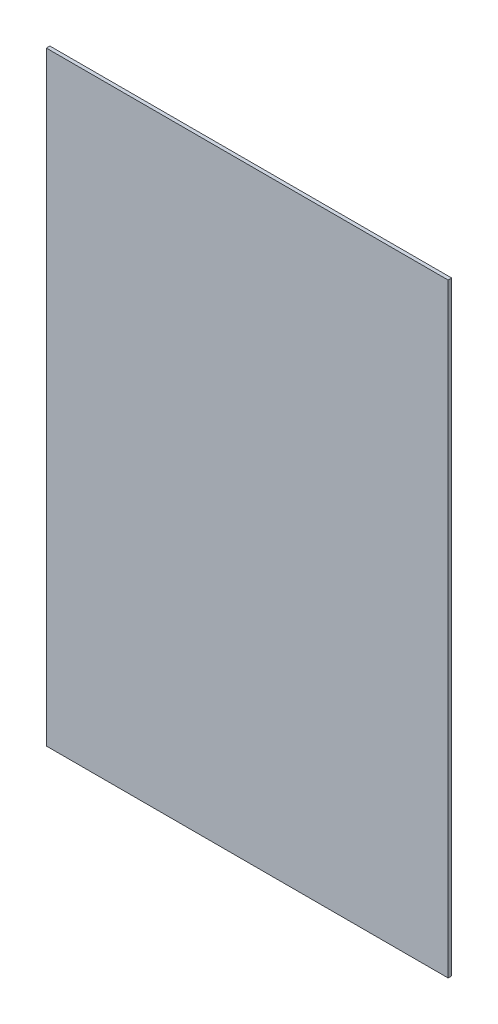
ISO-10303-21;
HEADER;
FILE_DESCRIPTION(('STEP AP214'),'2;1');
FILE_NAME('part.step','',(''),(''),'','','');
FILE_SCHEMA(('AUTOMOTIVE_DESIGN { 1 0 10303 214 1 1 1 1 }'));
ENDSEC;
DATA;
#1=APPLICATION_CONTEXT('core data for automotive mechanical design processes');
#2=APPLICATION_PROTOCOL_DEFINITION('international standard','automotive_design',2000,#1);
#3=PRODUCT_CONTEXT('',#1,'mechanical');
#4=PRODUCT('Part','Part','',(#3));
#5=PRODUCT_RELATED_PRODUCT_CATEGORY('part','',(#4));
#6=PRODUCT_DEFINITION_FORMATION('','',#4);
#7=PRODUCT_DEFINITION_CONTEXT('part definition',#1,'design');
#8=PRODUCT_DEFINITION('design','',#6,#7);
#9=PRODUCT_DEFINITION_SHAPE('','',#8);
#10=(LENGTH_UNIT() NAMED_UNIT(*) SI_UNIT(.MILLI.,.METRE.));
#11=(NAMED_UNIT(*) PLANE_ANGLE_UNIT() SI_UNIT($,.RADIAN.));
#12=(NAMED_UNIT(*) SI_UNIT($,.STERADIAN.) SOLID_ANGLE_UNIT());
#13=UNCERTAINTY_MEASURE_WITH_UNIT(LENGTH_MEASURE(1.E-05),#10,'distance_accuracy_value','');
#14=(GEOMETRIC_REPRESENTATION_CONTEXT(3) GLOBAL_UNCERTAINTY_ASSIGNED_CONTEXT((#13)) GLOBAL_UNIT_ASSIGNED_CONTEXT((#10,
#11,#12)) REPRESENTATION_CONTEXT('',''));
#15=CARTESIAN_POINT('',(0.,0.,0.));
#16=DIRECTION('',(0.,0.,1.));
#17=DIRECTION('',(1.,0.,0.));
#18=AXIS2_PLACEMENT_3D('',#15,#16,#17);
#19=CARTESIAN_POINT('',(113.,170.,2.));
#20=DIRECTION('',(-1.,0.,0.));
#21=DIRECTION('',(0.,-1.,0.));
#22=AXIS2_PLACEMENT_3D('',#19,#20,#21);
#23=PLANE('',#22);
#24=DIRECTION('',(0.,1.,0.));
#25=VECTOR('',#24,1.);
#26=CARTESIAN_POINT('',(113.,170.,0.));
#27=LINE('',#26,#25);
#28=CARTESIAN_POINT('',(113.,-170.,0.));
#29=VERTEX_POINT('',#28);
#30=CARTESIAN_POINT('',(113.,170.,0.));
#31=VERTEX_POINT('',#30);
#32=EDGE_CURVE('E102',#29,#31,#27,.T.);
#33=ORIENTED_EDGE('',*,*,#32,.T.);
#34=DIRECTION('',(0.,0.,-1.));
#35=VECTOR('',#34,1.);
#36=CARTESIAN_POINT('',(113.,170.,2.));
#37=LINE('',#36,#35);
#38=CARTESIAN_POINT('',(113.,170.,2.));
#39=VERTEX_POINT('',#38);
#40=EDGE_CURVE('E11',#39,#31,#37,.T.);
#41=ORIENTED_EDGE('',*,*,#40,.F.);
#42=DIRECTION('',(0.,1.,0.));
#43=VECTOR('',#42,1.);
#44=CARTESIAN_POINT('',(113.,170.,2.));
#45=LINE('',#44,#43);
#46=CARTESIAN_POINT('',(113.,-170.,2.));
#47=VERTEX_POINT('',#46);
#48=EDGE_CURVE('E90',#47,#39,#45,.T.);
#49=ORIENTED_EDGE('',*,*,#48,.F.);
#50=DIRECTION('',(0.,0.,-1.));
#51=VECTOR('',#50,1.);
#52=CARTESIAN_POINT('',(113.,-170.,2.));
#53=LINE('',#52,#51);
#54=EDGE_CURVE('E98',#47,#29,#53,.T.);
#55=ORIENTED_EDGE('',*,*,#54,.T.);
#56=EDGE_LOOP('',(#33,#41,#49,#55));
#57=FACE_BOUND('',#56,.T.);
#58=ADVANCED_FACE('F39',(#57),#23,.F.);
#59=CARTESIAN_POINT('',(-113.,170.,2.));
#60=DIRECTION('',(0.,-1.,0.));
#61=DIRECTION('',(0.,0.,-1.));
#62=AXIS2_PLACEMENT_3D('',#59,#60,#61);
#63=PLANE('',#62);
#64=DIRECTION('',(-1.,0.,0.));
#65=VECTOR('',#64,1.);
#66=CARTESIAN_POINT('',(-113.,170.,0.));
#67=LINE('',#66,#65);
#68=CARTESIAN_POINT('',(-113.,170.,0.));
#69=VERTEX_POINT('',#68);
#70=EDGE_CURVE('E94',#31,#69,#67,.T.);
#71=ORIENTED_EDGE('',*,*,#70,.T.);
#72=DIRECTION('',(0.,0.,-1.));
#73=VECTOR('',#72,1.);
#74=CARTESIAN_POINT('',(-113.,170.,2.));
#75=LINE('',#74,#73);
#76=CARTESIAN_POINT('',(-113.,170.,2.));
#77=VERTEX_POINT('',#76);
#78=EDGE_CURVE('E47',#77,#69,#75,.T.);
#79=ORIENTED_EDGE('',*,*,#78,.F.);
#80=DIRECTION('',(-1.,0.,0.));
#81=VECTOR('',#80,1.);
#82=CARTESIAN_POINT('',(-113.,170.,2.));
#83=LINE('',#82,#81);
#84=EDGE_CURVE('E85',#39,#77,#83,.T.);
#85=ORIENTED_EDGE('',*,*,#84,.F.);
#86=ORIENTED_EDGE('',*,*,#40,.T.);
#87=EDGE_LOOP('',(#71,#79,#85,#86));
#88=FACE_BOUND('',#87,.T.);
#89=ADVANCED_FACE('F93',(#88),#63,.F.);
#90=CARTESIAN_POINT('',(-113.,170.,2.));
#91=DIRECTION('',(1.,0.,0.));
#92=DIRECTION('',(0.,1.,0.));
#93=AXIS2_PLACEMENT_3D('',#90,#91,#92);
#94=PLANE('',#93);
#95=DIRECTION('',(0.,-1.,0.));
#96=VECTOR('',#95,1.);
#97=CARTESIAN_POINT('',(-113.,170.,0.));
#98=LINE('',#97,#96);
#99=CARTESIAN_POINT('',(-113.,-170.,0.));
#100=VERTEX_POINT('',#99);
#101=EDGE_CURVE('E72',#69,#100,#98,.T.);
#102=ORIENTED_EDGE('',*,*,#101,.T.);
#103=DIRECTION('',(0.,0.,-1.));
#104=VECTOR('',#103,1.);
#105=CARTESIAN_POINT('',(-113.,-170.,2.));
#106=LINE('',#105,#104);
#107=CARTESIAN_POINT('',(-113.,-170.,2.));
#108=VERTEX_POINT('',#107);
#109=EDGE_CURVE('E95',#108,#100,#106,.T.);
#110=ORIENTED_EDGE('',*,*,#109,.F.);
#111=DIRECTION('',(0.,-1.,0.));
#112=VECTOR('',#111,1.);
#113=CARTESIAN_POINT('',(-113.,170.,2.));
#114=LINE('',#113,#112);
#115=EDGE_CURVE('E88',#77,#108,#114,.T.);
#116=ORIENTED_EDGE('',*,*,#115,.F.);
#117=ORIENTED_EDGE('',*,*,#78,.T.);
#118=EDGE_LOOP('',(#102,#110,#116,#117));
#119=FACE_BOUND('',#118,.T.);
#120=ADVANCED_FACE('F96',(#119),#94,.F.);
#121=CARTESIAN_POINT('',(-113.,-170.,2.));
#122=DIRECTION('',(0.,1.,0.));
#123=DIRECTION('',(0.,0.,1.));
#124=AXIS2_PLACEMENT_3D('',#121,#122,#123);
#125=PLANE('',#124);
#126=DIRECTION('',(1.,0.,0.));
#127=VECTOR('',#126,1.);
#128=CARTESIAN_POINT('',(-113.,-170.,0.));
#129=LINE('',#128,#127);
#130=EDGE_CURVE('E78',#100,#29,#129,.T.);
#131=ORIENTED_EDGE('',*,*,#130,.T.);
#132=ORIENTED_EDGE('',*,*,#54,.F.);
#133=DIRECTION('',(1.,0.,0.));
#134=VECTOR('',#133,1.);
#135=CARTESIAN_POINT('',(-113.,-170.,2.));
#136=LINE('',#135,#134);
#137=EDGE_CURVE('E55',#108,#47,#136,.T.);
#138=ORIENTED_EDGE('',*,*,#137,.F.);
#139=ORIENTED_EDGE('',*,*,#109,.T.);
#140=EDGE_LOOP('',(#131,#132,#138,#139));
#141=FACE_BOUND('',#140,.T.);
#142=ADVANCED_FACE('F109',(#141),#125,.F.);
#143=CARTESIAN_POINT('',(0.,0.,2.));
#144=DIRECTION('',(0.,0.,1.));
#145=DIRECTION('',(1.,0.,0.));
#146=AXIS2_PLACEMENT_3D('',#143,#144,#145);
#147=PLANE('',#146);
#148=ORIENTED_EDGE('',*,*,#48,.T.);
#149=ORIENTED_EDGE('',*,*,#84,.T.);
#150=ORIENTED_EDGE('',*,*,#115,.T.);
#151=ORIENTED_EDGE('',*,*,#137,.T.);
#152=EDGE_LOOP('',(#148,#149,#150,#151));
#153=FACE_BOUND('',#152,.T.);
#154=ADVANCED_FACE('F86',(#153),#147,.T.);
#155=CARTESIAN_POINT('',(0.,0.,0.));
#156=DIRECTION('',(0.,0.,1.));
#157=DIRECTION('',(1.,0.,0.));
#158=AXIS2_PLACEMENT_3D('',#155,#156,#157);
#159=PLANE('',#158);
#160=ORIENTED_EDGE('',*,*,#32,.F.);
#161=ORIENTED_EDGE('',*,*,#130,.F.);
#162=ORIENTED_EDGE('',*,*,#101,.F.);
#163=ORIENTED_EDGE('',*,*,#70,.F.);
#164=EDGE_LOOP('',(#160,#161,#162,#163));
#165=FACE_BOUND('',#164,.T.);
#166=ADVANCED_FACE('F112',(#165),#159,.F.);
#167=CLOSED_SHELL('',(#58,#89,#120,#142,#154,#166));
#168=MANIFOLD_SOLID_BREP('B2',#167);
#169=ADVANCED_BREP_SHAPE_REPRESENTATION('',(#18,#168),#14);
#170=SHAPE_DEFINITION_REPRESENTATION(#9,#169);
ENDSEC;
END-ISO-10303-21;
